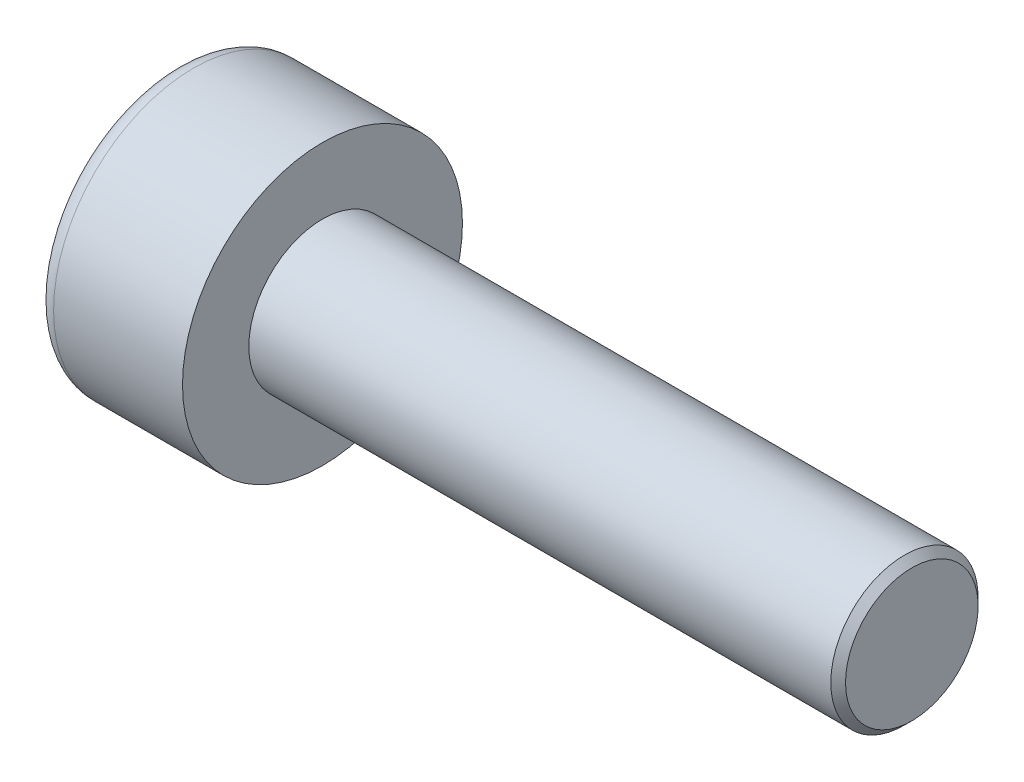
ISO-10303-21;
HEADER;
FILE_DESCRIPTION(('STEP AP214'),'2;1');
FILE_NAME('part.step','',(''),(''),'','','');
FILE_SCHEMA(('AUTOMOTIVE_DESIGN { 1 0 10303 214 1 1 1 1 }'));
ENDSEC;
DATA;
#1=APPLICATION_CONTEXT('core data for automotive mechanical design processes');
#2=APPLICATION_PROTOCOL_DEFINITION('international standard','automotive_design',2000,#1);
#3=PRODUCT_CONTEXT('',#1,'mechanical');
#4=PRODUCT('Part','Part','',(#3));
#5=PRODUCT_RELATED_PRODUCT_CATEGORY('part','',(#4));
#6=PRODUCT_DEFINITION_FORMATION('','',#4);
#7=PRODUCT_DEFINITION_CONTEXT('part definition',#1,'design');
#8=PRODUCT_DEFINITION('design','',#6,#7);
#9=PRODUCT_DEFINITION_SHAPE('','',#8);
#10=(LENGTH_UNIT() NAMED_UNIT(*) SI_UNIT(.MILLI.,.METRE.));
#11=(NAMED_UNIT(*) PLANE_ANGLE_UNIT() SI_UNIT($,.RADIAN.));
#12=(NAMED_UNIT(*) SI_UNIT($,.STERADIAN.) SOLID_ANGLE_UNIT());
#13=UNCERTAINTY_MEASURE_WITH_UNIT(LENGTH_MEASURE(1.E-05),#10,'distance_accuracy_value','');
#14=(GEOMETRIC_REPRESENTATION_CONTEXT(3) GLOBAL_UNCERTAINTY_ASSIGNED_CONTEXT((#13)) GLOBAL_UNIT_ASSIGNED_CONTEXT((#10,
#11,#12)) REPRESENTATION_CONTEXT('',''));
#15=CARTESIAN_POINT('',(0.,0.,0.));
#16=DIRECTION('',(0.,0.,1.));
#17=DIRECTION('',(1.,0.,0.));
#18=AXIS2_PLACEMENT_3D('',#15,#16,#17);
#19=CARTESIAN_POINT('',(1.00000000009004,0.,0.));
#20=DIRECTION('',(-1.,0.,0.));
#21=DIRECTION('',(0.,0.,1.));
#22=AXIS2_PLACEMENT_3D('',#19,#20,#21);
#23=CONICAL_SURFACE('',#22,0.749999999698048,1.04719755078461);
#24=CARTESIAN_POINT('',(1.43301270193774,0.,3.41060513164848E-10));
#25=VERTEX_POINT('',#24);
#26=VERTEX_LOOP('',#25);
#27=FACE_BOUND('',#26,.T.);
#28=CARTESIAN_POINT('',(0.999999999958766,0.,0.));
#29=DIRECTION('',(-1.,0.,0.));
#30=DIRECTION('',(0.,0.,1.));
#31=AXIS2_PLACEMENT_3D('',#28,#29,#30);
#32=CIRCLE('',#31,0.749999999925421);
#33=CARTESIAN_POINT('',(0.999999999979383,-0.374999999981356,0.649519052806036));
#34=VERTEX_POINT('',#33);
#35=CARTESIAN_POINT('',(0.999999999979383,0.374999999981355,0.649519052806036));
#36=VERTEX_POINT('',#35);
#37=EDGE_CURVE('E87',#34,#36,#32,.T.);
#38=ORIENTED_EDGE('',*,*,#37,.T.);
#39=CARTESIAN_POINT('',(0.999999999958766,0.,0.));
#40=DIRECTION('',(-1.,0.,0.));
#41=DIRECTION('',(0.,0.,1.));
#42=AXIS2_PLACEMENT_3D('',#39,#40,#41);
#43=CIRCLE('',#42,0.749999999925421);
#44=CARTESIAN_POINT('',(0.999999999979383,0.749999999962711,0.));
#45=VERTEX_POINT('',#44);
#46=EDGE_CURVE('E102',#36,#45,#43,.T.);
#47=ORIENTED_EDGE('',*,*,#46,.T.);
#48=CARTESIAN_POINT('',(0.999999999958766,0.,0.));
#49=DIRECTION('',(-1.,0.,0.));
#50=DIRECTION('',(0.,0.,1.));
#51=AXIS2_PLACEMENT_3D('',#48,#49,#50);
#52=CIRCLE('',#51,0.749999999925421);
#53=CARTESIAN_POINT('',(0.999999999979383,0.374999999981356,-0.649519052806035));
#54=VERTEX_POINT('',#53);
#55=EDGE_CURVE('E146',#45,#54,#52,.T.);
#56=ORIENTED_EDGE('',*,*,#55,.T.);
#57=CARTESIAN_POINT('',(0.999999999958766,0.,0.));
#58=DIRECTION('',(-1.,0.,0.));
#59=DIRECTION('',(0.,0.,1.));
#60=AXIS2_PLACEMENT_3D('',#57,#58,#59);
#61=CIRCLE('',#60,0.749999999925421);
#62=CARTESIAN_POINT('',(0.999999999979383,-0.374999999981355,-0.649519052806036));
#63=VERTEX_POINT('',#62);
#64=EDGE_CURVE('E134',#54,#63,#61,.T.);
#65=ORIENTED_EDGE('',*,*,#64,.T.);
#66=CARTESIAN_POINT('',(0.999999999958766,0.,0.));
#67=DIRECTION('',(-1.,0.,0.));
#68=DIRECTION('',(0.,0.,1.));
#69=AXIS2_PLACEMENT_3D('',#66,#67,#68);
#70=CIRCLE('',#69,0.749999999925421);
#71=CARTESIAN_POINT('',(0.999999999979383,-0.749999999962711,0.));
#72=VERTEX_POINT('',#71);
#73=EDGE_CURVE('E83',#63,#72,#70,.T.);
#74=ORIENTED_EDGE('',*,*,#73,.T.);
#75=CARTESIAN_POINT('',(0.999999999958766,0.,0.));
#76=DIRECTION('',(-1.,0.,0.));
#77=DIRECTION('',(0.,0.,1.));
#78=AXIS2_PLACEMENT_3D('',#75,#76,#77);
#79=CIRCLE('',#78,0.749999999925422);
#80=EDGE_CURVE('E85',#72,#34,#79,.T.);
#81=ORIENTED_EDGE('',*,*,#80,.T.);
#82=EDGE_LOOP('',(#38,#47,#56,#65,#74,#81));
#83=FACE_BOUND('',#82,.T.);
#84=ADVANCED_FACE('F16',(#27,#83),#23,.F.);
#85=CARTESIAN_POINT('',(1.,0.,-0.866025403784439));
#86=DIRECTION('',(1.,0.,0.));
#87=DIRECTION('',(0.,0.,-1.));
#88=AXIS2_PLACEMENT_3D('',#85,#86,#87);
#89=PLANE('',#88);
#90=DIRECTION('',(0.,0.,1.));
#91=VECTOR('',#90,1.);
#92=CARTESIAN_POINT('',(1.,-0.75,0.43301270189222));
#93=LINE('',#92,#91);
#94=CARTESIAN_POINT('',(1.,-0.75,0.433012701892219));
#95=VERTEX_POINT('',#94);
#96=EDGE_CURVE('E108',#95,#72,#93,.F.);
#97=ORIENTED_EDGE('',*,*,#96,.F.);
#98=DIRECTION('',(0.,0.866025403784439,0.5));
#99=VECTOR('',#98,1.);
#100=CARTESIAN_POINT('',(1.,0.,0.866025403784439));
#101=LINE('',#100,#99);
#102=EDGE_CURVE('E105',#34,#95,#101,.F.);
#103=ORIENTED_EDGE('',*,*,#102,.F.);
#104=ORIENTED_EDGE('',*,*,#80,.F.);
#105=EDGE_LOOP('',(#97,#103,#104));
#106=FACE_BOUND('',#105,.T.);
#107=ADVANCED_FACE('F106',(#106),#89,.F.);
#108=CARTESIAN_POINT('',(1.,0.,-0.866025403784439));
#109=DIRECTION('',(1.,0.,0.));
#110=DIRECTION('',(0.,0.,-1.));
#111=AXIS2_PLACEMENT_3D('',#108,#109,#110);
#112=PLANE('',#111);
#113=DIRECTION('',(0.,0.866025403784439,0.5));
#114=VECTOR('',#113,1.);
#115=CARTESIAN_POINT('',(1.,0.,0.866025403784439));
#116=LINE('',#115,#114);
#117=CARTESIAN_POINT('',(1.,0.,0.866025403784439));
#118=VERTEX_POINT('',#117);
#119=EDGE_CURVE('E97',#118,#34,#116,.F.);
#120=ORIENTED_EDGE('',*,*,#119,.F.);
#121=DIRECTION('',(0.,0.866025403784439,-0.5));
#122=VECTOR('',#121,1.);
#123=CARTESIAN_POINT('',(1.,0.75,0.43301270189222));
#124=LINE('',#123,#122);
#125=EDGE_CURVE('E100',#36,#118,#124,.F.);
#126=ORIENTED_EDGE('',*,*,#125,.F.);
#127=ORIENTED_EDGE('',*,*,#37,.F.);
#128=EDGE_LOOP('',(#120,#126,#127));
#129=FACE_BOUND('',#128,.T.);
#130=ADVANCED_FACE('F95',(#129),#112,.F.);
#131=CARTESIAN_POINT('',(1.,0.,-0.866025403784439));
#132=DIRECTION('',(1.,0.,0.));
#133=DIRECTION('',(0.,0.,-1.));
#134=AXIS2_PLACEMENT_3D('',#131,#132,#133);
#135=PLANE('',#134);
#136=DIRECTION('',(0.,0.866025403784439,-0.5));
#137=VECTOR('',#136,1.);
#138=CARTESIAN_POINT('',(1.,0.75,0.43301270189222));
#139=LINE('',#138,#137);
#140=CARTESIAN_POINT('',(1.,0.75,0.43301270189222));
#141=VERTEX_POINT('',#140);
#142=EDGE_CURVE('E130',#141,#36,#139,.F.);
#143=ORIENTED_EDGE('',*,*,#142,.F.);
#144=DIRECTION('',(0.,0.,-1.));
#145=VECTOR('',#144,1.);
#146=CARTESIAN_POINT('',(1.,0.75,-0.433012701892219));
#147=LINE('',#146,#145);
#148=EDGE_CURVE('E191',#45,#141,#147,.F.);
#149=ORIENTED_EDGE('',*,*,#148,.F.);
#150=ORIENTED_EDGE('',*,*,#46,.F.);
#151=EDGE_LOOP('',(#143,#149,#150));
#152=FACE_BOUND('',#151,.T.);
#153=ADVANCED_FACE('F400',(#152),#135,.F.);
#154=CARTESIAN_POINT('',(1.,0.,-0.866025403784439));
#155=DIRECTION('',(1.,0.,0.));
#156=DIRECTION('',(0.,0.,-1.));
#157=AXIS2_PLACEMENT_3D('',#154,#155,#156);
#158=PLANE('',#157);
#159=DIRECTION('',(0.,0.,-1.));
#160=VECTOR('',#159,1.);
#161=CARTESIAN_POINT('',(1.,0.75,-0.433012701892219));
#162=LINE('',#161,#160);
#163=CARTESIAN_POINT('',(1.,0.75,-0.433012701892219));
#164=VERTEX_POINT('',#163);
#165=EDGE_CURVE('E188',#164,#45,#162,.F.);
#166=ORIENTED_EDGE('',*,*,#165,.F.);
#167=DIRECTION('',(0.,-0.866025403784438,-0.500000000000001));
#168=VECTOR('',#167,1.);
#169=CARTESIAN_POINT('',(1.,0.,-0.866025403784439));
#170=LINE('',#169,#168);
#171=EDGE_CURVE('E176',#54,#164,#170,.F.);
#172=ORIENTED_EDGE('',*,*,#171,.F.);
#173=ORIENTED_EDGE('',*,*,#55,.F.);
#174=EDGE_LOOP('',(#166,#172,#173));
#175=FACE_BOUND('',#174,.T.);
#176=ADVANCED_FACE('F390',(#175),#158,.F.);
#177=CARTESIAN_POINT('',(1.,0.,-0.866025403784439));
#178=DIRECTION('',(1.,0.,0.));
#179=DIRECTION('',(0.,0.,-1.));
#180=AXIS2_PLACEMENT_3D('',#177,#178,#179);
#181=PLANE('',#180);
#182=DIRECTION('',(0.,-0.866025403784439,0.5));
#183=VECTOR('',#182,1.);
#184=CARTESIAN_POINT('',(1.,-0.75,-0.43301270189222));
#185=LINE('',#184,#183);
#186=CARTESIAN_POINT('',(1.,-0.75,-0.43301270189222));
#187=VERTEX_POINT('',#186);
#188=EDGE_CURVE('E230',#187,#63,#185,.F.);
#189=ORIENTED_EDGE('',*,*,#188,.F.);
#190=DIRECTION('',(0.,0.,1.));
#191=VECTOR('',#190,1.);
#192=CARTESIAN_POINT('',(1.,-0.75,0.43301270189222));
#193=LINE('',#192,#191);
#194=EDGE_CURVE('E118',#72,#187,#193,.F.);
#195=ORIENTED_EDGE('',*,*,#194,.F.);
#196=ORIENTED_EDGE('',*,*,#73,.F.);
#197=EDGE_LOOP('',(#189,#195,#196));
#198=FACE_BOUND('',#197,.T.);
#199=ADVANCED_FACE('F380',(#198),#181,.F.);
#200=CARTESIAN_POINT('',(1.,0.,-0.866025403784439));
#201=DIRECTION('',(1.,0.,0.));
#202=DIRECTION('',(0.,0.,-1.));
#203=AXIS2_PLACEMENT_3D('',#200,#201,#202);
#204=PLANE('',#203);
#205=DIRECTION('',(0.,-0.866025403784438,-0.500000000000001));
#206=VECTOR('',#205,1.);
#207=CARTESIAN_POINT('',(1.,0.,-0.866025403784439));
#208=LINE('',#207,#206);
#209=CARTESIAN_POINT('',(1.,0.,-0.866025403784439));
#210=VERTEX_POINT('',#209);
#211=EDGE_CURVE('E180',#210,#54,#208,.F.);
#212=ORIENTED_EDGE('',*,*,#211,.F.);
#213=DIRECTION('',(0.,-0.866025403784439,0.5));
#214=VECTOR('',#213,1.);
#215=CARTESIAN_POINT('',(1.,-0.75,-0.43301270189222));
#216=LINE('',#215,#214);
#217=EDGE_CURVE('E512',#63,#210,#216,.F.);
#218=ORIENTED_EDGE('',*,*,#217,.F.);
#219=ORIENTED_EDGE('',*,*,#64,.F.);
#220=EDGE_LOOP('',(#212,#218,#219));
#221=FACE_BOUND('',#220,.T.);
#222=ADVANCED_FACE('F370',(#221),#204,.F.);
#223=CARTESIAN_POINT('',(1.,-0.75,0.43301270189222));
#224=DIRECTION('',(0.,1.,0.));
#225=DIRECTION('',(0.,0.,1.));
#226=AXIS2_PLACEMENT_3D('',#223,#224,#225);
#227=PLANE('',#226);
#228=ORIENTED_EDGE('',*,*,#194,.T.);
#229=DIRECTION('',(1.,0.,0.));
#230=VECTOR('',#229,1.);
#231=CARTESIAN_POINT('',(1.,-0.75,-0.43301270189222));
#232=LINE('',#231,#230);
#233=CARTESIAN_POINT('',(0.,-0.75,-0.43301270189222));
#234=VERTEX_POINT('',#233);
#235=EDGE_CURVE('E185',#234,#187,#232,.T.);
#236=ORIENTED_EDGE('',*,*,#235,.F.);
#237=DIRECTION('',(0.,0.,-1.));
#238=VECTOR('',#237,1.);
#239=CARTESIAN_POINT('',(0.,-0.75,0.));
#240=LINE('',#239,#238);
#241=CARTESIAN_POINT('',(0.,-0.75,0.43301270189222));
#242=VERTEX_POINT('',#241);
#243=EDGE_CURVE('E169',#234,#242,#240,.F.);
#244=ORIENTED_EDGE('',*,*,#243,.T.);
#245=DIRECTION('',(1.,0.,0.));
#246=VECTOR('',#245,1.);
#247=CARTESIAN_POINT('',(1.,-0.75,0.433012701892219));
#248=LINE('',#247,#246);
#249=EDGE_CURVE('E112',#95,#242,#248,.F.);
#250=ORIENTED_EDGE('',*,*,#249,.F.);
#251=ORIENTED_EDGE('',*,*,#96,.T.);
#252=EDGE_LOOP('',(#228,#236,#244,#250,#251));
#253=FACE_BOUND('',#252,.T.);
#254=ADVANCED_FACE('F361',(#253),#227,.T.);
#255=CARTESIAN_POINT('',(1.,0.,0.866025403784439));
#256=DIRECTION('',(0.,0.5,-0.866025403784439));
#257=DIRECTION('',(0.,0.866025403784439,0.5));
#258=AXIS2_PLACEMENT_3D('',#255,#256,#257);
#259=PLANE('',#258);
#260=ORIENTED_EDGE('',*,*,#102,.T.);
#261=ORIENTED_EDGE('',*,*,#249,.T.);
#262=DIRECTION('',(0.,0.866025403784438,0.5));
#263=VECTOR('',#262,1.);
#264=CARTESIAN_POINT('',(0.,-0.75,0.43301270189222));
#265=LINE('',#264,#263);
#266=CARTESIAN_POINT('',(0.,0.,0.866025403784439));
#267=VERTEX_POINT('',#266);
#268=EDGE_CURVE('E172',#242,#267,#265,.T.);
#269=ORIENTED_EDGE('',*,*,#268,.T.);
#270=DIRECTION('',(1.,0.,0.));
#271=VECTOR('',#270,1.);
#272=CARTESIAN_POINT('',(1.,0.,0.866025403784439));
#273=LINE('',#272,#271);
#274=EDGE_CURVE('E117',#118,#267,#273,.F.);
#275=ORIENTED_EDGE('',*,*,#274,.F.);
#276=ORIENTED_EDGE('',*,*,#119,.T.);
#277=EDGE_LOOP('',(#260,#261,#269,#275,#276));
#278=FACE_BOUND('',#277,.T.);
#279=ADVANCED_FACE('F114',(#278),#259,.T.);
#280=CARTESIAN_POINT('',(1.,0.75,0.43301270189222));
#281=DIRECTION('',(0.,-0.5,-0.866025403784439));
#282=DIRECTION('',(0.,0.866025403784439,-0.5));
#283=AXIS2_PLACEMENT_3D('',#280,#281,#282);
#284=PLANE('',#283);
#285=ORIENTED_EDGE('',*,*,#125,.T.);
#286=ORIENTED_EDGE('',*,*,#274,.T.);
#287=DIRECTION('',(0.,0.866025403784439,-0.5));
#288=VECTOR('',#287,1.);
#289=CARTESIAN_POINT('',(0.,0.,0.866025403784439));
#290=LINE('',#289,#288);
#291=CARTESIAN_POINT('',(0.,0.75,0.43301270189222));
#292=VERTEX_POINT('',#291);
#293=EDGE_CURVE('E215',#267,#292,#290,.T.);
#294=ORIENTED_EDGE('',*,*,#293,.T.);
#295=DIRECTION('',(1.,0.,0.));
#296=VECTOR('',#295,1.);
#297=CARTESIAN_POINT('',(1.,0.75,0.43301270189222));
#298=LINE('',#297,#296);
#299=EDGE_CURVE('E196',#141,#292,#298,.F.);
#300=ORIENTED_EDGE('',*,*,#299,.F.);
#301=ORIENTED_EDGE('',*,*,#142,.T.);
#302=EDGE_LOOP('',(#285,#286,#294,#300,#301));
#303=FACE_BOUND('',#302,.T.);
#304=ADVANCED_FACE('F212',(#303),#284,.T.);
#305=CARTESIAN_POINT('',(1.,0.75,-0.433012701892219));
#306=DIRECTION('',(0.,-1.,0.));
#307=DIRECTION('',(0.,0.,-1.));
#308=AXIS2_PLACEMENT_3D('',#305,#306,#307);
#309=PLANE('',#308);
#310=ORIENTED_EDGE('',*,*,#148,.T.);
#311=ORIENTED_EDGE('',*,*,#299,.T.);
#312=DIRECTION('',(0.,0.,-1.));
#313=VECTOR('',#312,1.);
#314=CARTESIAN_POINT('',(0.,0.75,0.));
#315=LINE('',#314,#313);
#316=CARTESIAN_POINT('',(0.,0.75,-0.433012701892219));
#317=VERTEX_POINT('',#316);
#318=EDGE_CURVE('E162',#292,#317,#315,.T.);
#319=ORIENTED_EDGE('',*,*,#318,.T.);
#320=DIRECTION('',(1.,0.,0.));
#321=VECTOR('',#320,1.);
#322=CARTESIAN_POINT('',(1.,0.75,-0.433012701892219));
#323=LINE('',#322,#321);
#324=EDGE_CURVE('E179',#164,#317,#323,.F.);
#325=ORIENTED_EDGE('',*,*,#324,.F.);
#326=ORIENTED_EDGE('',*,*,#165,.T.);
#327=EDGE_LOOP('',(#310,#311,#319,#325,#326));
#328=FACE_BOUND('',#327,.T.);
#329=ADVANCED_FACE('F334',(#328),#309,.T.);
#330=CARTESIAN_POINT('',(1.,0.,-0.866025403784439));
#331=DIRECTION('',(0.,-0.500000000000001,0.866025403784438));
#332=DIRECTION('',(0.,-0.866025403784438,-0.500000000000001));
#333=AXIS2_PLACEMENT_3D('',#330,#331,#332);
#334=PLANE('',#333);
#335=ORIENTED_EDGE('',*,*,#171,.T.);
#336=ORIENTED_EDGE('',*,*,#324,.T.);
#337=DIRECTION('',(0.,-0.866025403784438,-0.500000000000001));
#338=VECTOR('',#337,1.);
#339=CARTESIAN_POINT('',(0.,0.75,-0.433012701892219));
#340=LINE('',#339,#338);
#341=CARTESIAN_POINT('',(0.,0.,-0.866025403784439));
#342=VERTEX_POINT('',#341);
#343=EDGE_CURVE('E154',#317,#342,#340,.T.);
#344=ORIENTED_EDGE('',*,*,#343,.T.);
#345=DIRECTION('',(1.,0.,0.));
#346=VECTOR('',#345,1.);
#347=CARTESIAN_POINT('',(1.,0.,-0.866025403784439));
#348=LINE('',#347,#346);
#349=EDGE_CURVE('E173',#210,#342,#348,.F.);
#350=ORIENTED_EDGE('',*,*,#349,.F.);
#351=ORIENTED_EDGE('',*,*,#211,.T.);
#352=EDGE_LOOP('',(#335,#336,#344,#350,#351));
#353=FACE_BOUND('',#352,.T.);
#354=ADVANCED_FACE('F274',(#353),#334,.T.);
#355=CARTESIAN_POINT('',(1.,-0.75,-0.43301270189222));
#356=DIRECTION('',(0.,0.5,0.866025403784439));
#357=DIRECTION('',(0.,-0.866025403784439,0.5));
#358=AXIS2_PLACEMENT_3D('',#355,#356,#357);
#359=PLANE('',#358);
#360=ORIENTED_EDGE('',*,*,#217,.T.);
#361=ORIENTED_EDGE('',*,*,#349,.T.);
#362=DIRECTION('',(0.,-0.866025403784439,0.5));
#363=VECTOR('',#362,1.);
#364=CARTESIAN_POINT('',(0.,0.,-0.866025403784439));
#365=LINE('',#364,#363);
#366=EDGE_CURVE('E152',#342,#234,#365,.T.);
#367=ORIENTED_EDGE('',*,*,#366,.T.);
#368=ORIENTED_EDGE('',*,*,#235,.T.);
#369=ORIENTED_EDGE('',*,*,#188,.T.);
#370=EDGE_LOOP('',(#360,#361,#367,#368,#369));
#371=FACE_BOUND('',#370,.T.);
#372=ADVANCED_FACE('F269',(#371),#359,.T.);
#373=CARTESIAN_POINT('',(0.,0.,0.));
#374=DIRECTION('',(1.,0.,0.));
#375=DIRECTION('',(0.,0.,-1.));
#376=AXIS2_PLACEMENT_3D('',#373,#374,#375);
#377=PLANE('',#376);
#378=ORIENTED_EDGE('',*,*,#343,.F.);
#379=ORIENTED_EDGE('',*,*,#318,.F.);
#380=ORIENTED_EDGE('',*,*,#293,.F.);
#381=ORIENTED_EDGE('',*,*,#268,.F.);
#382=ORIENTED_EDGE('',*,*,#243,.F.);
#383=ORIENTED_EDGE('',*,*,#366,.F.);
#384=EDGE_LOOP('',(#378,#379,#380,#381,#382,#383));
#385=FACE_BOUND('',#384,.T.);
#386=CARTESIAN_POINT('',(0.,0.,0.));
#387=DIRECTION('',(1.,0.,0.));
#388=DIRECTION('',(0.,0.,-1.));
#389=AXIS2_PLACEMENT_3D('',#386,#387,#388);
#390=CIRCLE('',#389,1.65);
#391=CARTESIAN_POINT('',(0.,0.,-1.65));
#392=VERTEX_POINT('',#391);
#393=CARTESIAN_POINT('',(0.,0.,1.65));
#394=VERTEX_POINT('',#393);
#395=EDGE_CURVE('E150',#392,#394,#390,.T.);
#396=ORIENTED_EDGE('',*,*,#395,.F.);
#397=CARTESIAN_POINT('',(0.,0.,0.));
#398=DIRECTION('',(1.,0.,0.));
#399=DIRECTION('',(0.,0.,1.));
#400=AXIS2_PLACEMENT_3D('',#397,#398,#399);
#401=CIRCLE('',#400,1.65);
#402=EDGE_CURVE('E35',#394,#392,#401,.T.);
#403=ORIENTED_EDGE('',*,*,#402,.F.);
#404=EDGE_LOOP('',(#396,#403));
#405=FACE_BOUND('',#404,.T.);
#406=ADVANCED_FACE('F221',(#385,#405),#377,.F.);
#407=CARTESIAN_POINT('',(0.25,0.,0.));
#408=DIRECTION('',(1.,0.,0.));
#409=DIRECTION('',(0.,0.,-1.));
#410=AXIS2_PLACEMENT_3D('',#407,#408,#409);
#411=TOROIDAL_SURFACE('',#410,1.65,0.25);
#412=CARTESIAN_POINT('',(0.25,0.,0.));
#413=DIRECTION('',(-1.,0.,0.));
#414=DIRECTION('',(0.,0.,1.));
#415=AXIS2_PLACEMENT_3D('',#412,#413,#414);
#416=CIRCLE('',#415,1.9);
#417=CARTESIAN_POINT('',(0.25,0.,1.9));
#418=VERTEX_POINT('',#417);
#419=EDGE_CURVE('E143',#418,#418,#416,.F.);
#420=ORIENTED_EDGE('',*,*,#419,.F.);
#421=EDGE_LOOP('',(#420));
#422=FACE_BOUND('',#421,.T.);
#423=ORIENTED_EDGE('',*,*,#395,.T.);
#424=ORIENTED_EDGE('',*,*,#402,.T.);
#425=EDGE_LOOP('',(#423,#424));
#426=FACE_BOUND('',#425,.T.);
#427=ADVANCED_FACE('F149',(#422,#426),#411,.T.);
#428=CARTESIAN_POINT('',(10.,0.,0.));
#429=DIRECTION('',(1.,0.,0.));
#430=DIRECTION('',(0.,0.,-1.));
#431=AXIS2_PLACEMENT_3D('',#428,#429,#430);
#432=PLANE('',#431);
#433=CARTESIAN_POINT('',(9.99999999999091,0.,0.));
#434=DIRECTION('',(-1.,0.,0.));
#435=DIRECTION('',(0.,0.,1.));
#436=AXIS2_PLACEMENT_3D('',#433,#434,#435);
#437=CIRCLE('',#436,0.900000000058299);
#438=CARTESIAN_POINT('',(9.99999999999091,0.,0.900000000058299));
#439=VERTEX_POINT('',#438);
#440=EDGE_CURVE('E140',#439,#439,#437,.T.);
#441=ORIENTED_EDGE('',*,*,#440,.F.);
#442=EDGE_LOOP('',(#441));
#443=FACE_BOUND('',#442,.T.);
#444=ADVANCED_FACE('F242',(#443),#432,.T.);
#445=CARTESIAN_POINT('',(2.,0.,0.));
#446=DIRECTION('',(-1.,0.,0.));
#447=DIRECTION('',(0.,0.,1.));
#448=AXIS2_PLACEMENT_3D('',#445,#446,#447);
#449=CYLINDRICAL_SURFACE('',#448,1.9);
#450=ORIENTED_EDGE('',*,*,#419,.T.);
#451=EDGE_LOOP('',(#450));
#452=FACE_BOUND('',#451,.T.);
#453=CARTESIAN_POINT('',(2.,0.,0.));
#454=DIRECTION('',(-1.,0.,0.));
#455=DIRECTION('',(0.,0.,1.));
#456=AXIS2_PLACEMENT_3D('',#453,#454,#455);
#457=CIRCLE('',#456,1.9);
#458=CARTESIAN_POINT('',(2.,0.,1.9));
#459=VERTEX_POINT('',#458);
#460=EDGE_CURVE('E137',#459,#459,#457,.F.);
#461=ORIENTED_EDGE('',*,*,#460,.F.);
#462=EDGE_LOOP('',(#461));
#463=FACE_BOUND('',#462,.T.);
#464=ADVANCED_FACE('F289',(#452,#463),#449,.T.);
#465=CARTESIAN_POINT('',(9.90000000007285,0.,0.));
#466=DIRECTION('',(-1.,0.,0.));
#467=DIRECTION('',(0.,0.,1.));
#468=AXIS2_PLACEMENT_3D('',#465,#466,#467);
#469=CONICAL_SURFACE('',#468,0.999999999976353,0.785398163397448);
#470=CARTESIAN_POINT('',(9.9,0.,0.));
#471=DIRECTION('',(-1.,0.,0.));
#472=DIRECTION('',(0.,0.,1.));
#473=AXIS2_PLACEMENT_3D('',#470,#471,#472);
#474=CIRCLE('',#473,1.);
#475=CARTESIAN_POINT('',(9.9,0.,1.));
#476=VERTEX_POINT('',#475);
#477=EDGE_CURVE('E27',#476,#476,#474,.T.);
#478=ORIENTED_EDGE('',*,*,#477,.F.);
#479=EDGE_LOOP('',(#478));
#480=FACE_BOUND('',#479,.T.);
#481=ORIENTED_EDGE('',*,*,#440,.T.);
#482=EDGE_LOOP('',(#481));
#483=FACE_BOUND('',#482,.T.);
#484=ADVANCED_FACE('F283',(#480,#483),#469,.T.);
#485=CARTESIAN_POINT('',(2.,0.,0.));
#486=DIRECTION('',(1.,0.,0.));
#487=DIRECTION('',(0.,0.,-1.));
#488=AXIS2_PLACEMENT_3D('',#485,#486,#487);
#489=PLANE('',#488);
#490=CARTESIAN_POINT('',(2.,0.,0.));
#491=DIRECTION('',(-1.,0.,0.));
#492=DIRECTION('',(0.,0.,1.));
#493=AXIS2_PLACEMENT_3D('',#490,#491,#492);
#494=CIRCLE('',#493,1.);
#495=CARTESIAN_POINT('',(2.,0.,1.));
#496=VERTEX_POINT('',#495);
#497=EDGE_CURVE('E11',#496,#496,#494,.F.);
#498=ORIENTED_EDGE('',*,*,#497,.F.);
#499=EDGE_LOOP('',(#498));
#500=FACE_BOUND('',#499,.T.);
#501=ORIENTED_EDGE('',*,*,#460,.T.);
#502=EDGE_LOOP('',(#501));
#503=FACE_BOUND('',#502,.T.);
#504=ADVANCED_FACE('F277',(#500,#503),#489,.T.);
#505=CARTESIAN_POINT('',(10.,0.,0.));
#506=DIRECTION('',(-1.,0.,0.));
#507=DIRECTION('',(0.,0.,1.));
#508=AXIS2_PLACEMENT_3D('',#505,#506,#507);
#509=CYLINDRICAL_SURFACE('',#508,1.);
#510=ORIENTED_EDGE('',*,*,#497,.T.);
#511=EDGE_LOOP('',(#510));
#512=FACE_BOUND('',#511,.T.);
#513=ORIENTED_EDGE('',*,*,#477,.T.);
#514=EDGE_LOOP('',(#513));
#515=FACE_BOUND('',#514,.T.);
#516=ADVANCED_FACE('F275',(#512,#515),#509,.T.);
#517=CLOSED_SHELL('',(#84,#107,#130,#153,#176,#199,#222,#254,#279,#304,#329,#354,#372,#406,#427,
#444,#464,#484,#504,#516));
#518=MANIFOLD_SOLID_BREP('B1',#517);
#519=ADVANCED_BREP_SHAPE_REPRESENTATION('',(#18,#518),#14);
#520=SHAPE_DEFINITION_REPRESENTATION(#9,#519);
ENDSEC;
END-ISO-10303-21;
